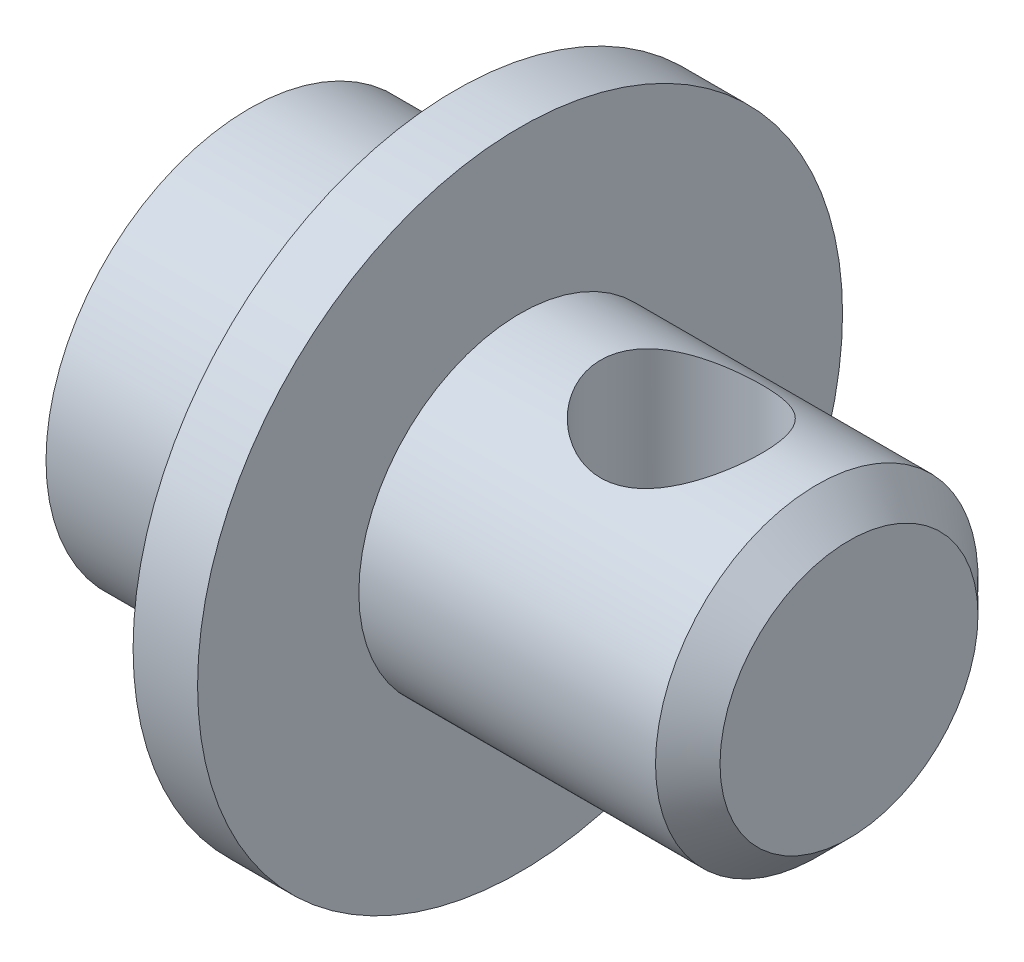
ISO-10303-21;
HEADER;
FILE_DESCRIPTION(('STEP AP214'),'2;1');
FILE_NAME('part.step','',(''),(''),'','','');
FILE_SCHEMA(('AUTOMOTIVE_DESIGN { 1 0 10303 214 1 1 1 1 }'));
ENDSEC;
DATA;
#1=APPLICATION_CONTEXT('core data for automotive mechanical design processes');
#2=APPLICATION_PROTOCOL_DEFINITION('international standard','automotive_design',2000,#1);
#3=PRODUCT_CONTEXT('',#1,'mechanical');
#4=PRODUCT('Part','Part','',(#3));
#5=PRODUCT_RELATED_PRODUCT_CATEGORY('part','',(#4));
#6=PRODUCT_DEFINITION_FORMATION('','',#4);
#7=PRODUCT_DEFINITION_CONTEXT('part definition',#1,'design');
#8=PRODUCT_DEFINITION('design','',#6,#7);
#9=PRODUCT_DEFINITION_SHAPE('','',#8);
#10=(LENGTH_UNIT() NAMED_UNIT(*) SI_UNIT(.MILLI.,.METRE.));
#11=(NAMED_UNIT(*) PLANE_ANGLE_UNIT() SI_UNIT($,.RADIAN.));
#12=(NAMED_UNIT(*) SI_UNIT($,.STERADIAN.) SOLID_ANGLE_UNIT());
#13=UNCERTAINTY_MEASURE_WITH_UNIT(LENGTH_MEASURE(1.E-05),#10,'distance_accuracy_value','');
#14=(GEOMETRIC_REPRESENTATION_CONTEXT(3) GLOBAL_UNCERTAINTY_ASSIGNED_CONTEXT((#13)) GLOBAL_UNIT_ASSIGNED_CONTEXT((#10,
#11,#12)) REPRESENTATION_CONTEXT('',''));
#15=CARTESIAN_POINT('',(0.,0.,0.));
#16=DIRECTION('',(0.,0.,1.));
#17=DIRECTION('',(1.,0.,0.));
#18=AXIS2_PLACEMENT_3D('',#15,#16,#17);
#19=CARTESIAN_POINT('',(5.,0.,0.));
#20=DIRECTION('',(1.,0.,0.));
#21=DIRECTION('',(0.,0.,-1.));
#22=AXIS2_PLACEMENT_3D('',#19,#20,#21);
#23=PLANE('',#22);
#24=CARTESIAN_POINT('',(5.,0.,0.));
#25=DIRECTION('',(-1.,0.,0.));
#26=DIRECTION('',(0.,0.,1.));
#27=AXIS2_PLACEMENT_3D('',#24,#25,#26);
#28=CIRCLE('',#27,1.72719999999999);
#29=CARTESIAN_POINT('',(5.,0.,1.72719999999999));
#30=VERTEX_POINT('',#29);
#31=EDGE_CURVE('E18',#30,#30,#28,.T.);
#32=ORIENTED_EDGE('',*,*,#31,.T.);
#33=EDGE_LOOP('',(#32));
#34=FACE_BOUND('',#33,.T.);
#35=ADVANCED_FACE('F15',(#34),#23,.F.);
#36=CARTESIAN_POINT('',(0.,0.,0.));
#37=DIRECTION('',(-1.,0.,0.));
#38=DIRECTION('',(0.,0.,1.));
#39=AXIS2_PLACEMENT_3D('',#36,#37,#38);
#40=CYLINDRICAL_SURFACE('',#39,1.72719999999999);
#41=ORIENTED_EDGE('',*,*,#31,.F.);
#42=EDGE_LOOP('',(#41));
#43=FACE_BOUND('',#42,.T.);
#44=CARTESIAN_POINT('',(0.,0.,0.));
#45=DIRECTION('',(-1.,0.,0.));
#46=DIRECTION('',(0.,0.,1.));
#47=AXIS2_PLACEMENT_3D('',#44,#45,#46);
#48=CIRCLE('',#47,1.72719999999999);
#49=CARTESIAN_POINT('',(0.,0.,1.72719999999999));
#50=VERTEX_POINT('',#49);
#51=EDGE_CURVE('E160',#50,#50,#48,.T.);
#52=ORIENTED_EDGE('',*,*,#51,.T.);
#53=EDGE_LOOP('',(#52));
#54=FACE_BOUND('',#53,.T.);
#55=ADVANCED_FACE('F135',(#43,#54),#40,.F.);
#56=CARTESIAN_POINT('',(0.,0.,0.));
#57=DIRECTION('',(1.,0.,0.));
#58=DIRECTION('',(0.,0.,-1.));
#59=AXIS2_PLACEMENT_3D('',#56,#57,#58);
#60=PLANE('',#59);
#61=CARTESIAN_POINT('',(0.,0.,0.));
#62=DIRECTION('',(-1.,0.,0.));
#63=DIRECTION('',(0.,0.,1.));
#64=AXIS2_PLACEMENT_3D('',#61,#62,#63);
#65=CIRCLE('',#64,3.15);
#66=CARTESIAN_POINT('',(0.,0.,3.15));
#67=VERTEX_POINT('',#66);
#68=EDGE_CURVE('E162',#67,#67,#65,.F.);
#69=ORIENTED_EDGE('',*,*,#68,.F.);
#70=EDGE_LOOP('',(#69));
#71=FACE_BOUND('',#70,.T.);
#72=ORIENTED_EDGE('',*,*,#51,.F.);
#73=EDGE_LOOP('',(#72));
#74=FACE_BOUND('',#73,.T.);
#75=ADVANCED_FACE('F125',(#71,#74),#60,.F.);
#76=CARTESIAN_POINT('',(0.,0.,0.));
#77=DIRECTION('',(-1.,0.,0.));
#78=DIRECTION('',(0.,0.,1.));
#79=AXIS2_PLACEMENT_3D('',#76,#77,#78);
#80=CYLINDRICAL_SURFACE('',#79,3.15);
#81=ORIENTED_EDGE('',*,*,#68,.T.);
#82=EDGE_LOOP('',(#81));
#83=FACE_BOUND('',#82,.T.);
#84=CARTESIAN_POINT('',(3.2,0.,0.));
#85=DIRECTION('',(-1.,0.,0.));
#86=DIRECTION('',(0.,0.,1.));
#87=AXIS2_PLACEMENT_3D('',#84,#85,#86);
#88=CIRCLE('',#87,3.15);
#89=CARTESIAN_POINT('',(3.2,0.,3.15));
#90=VERTEX_POINT('',#89);
#91=EDGE_CURVE('E166',#90,#90,#88,.T.);
#92=ORIENTED_EDGE('',*,*,#91,.T.);
#93=EDGE_LOOP('',(#92));
#94=FACE_BOUND('',#93,.T.);
#95=ADVANCED_FACE('F115',(#83,#94),#80,.T.);
#96=CARTESIAN_POINT('',(9.3,2.5,0.));
#97=DIRECTION('',(-1.,0.,0.));
#98=DIRECTION('',(0.,0.,1.));
#99=AXIS2_PLACEMENT_3D('',#96,#97,#98);
#100=PLANE('',#99);
#101=CARTESIAN_POINT('',(9.29999999993925,0.,0.));
#102=DIRECTION('',(-1.,0.,0.));
#103=DIRECTION('',(0.,0.,1.));
#104=AXIS2_PLACEMENT_3D('',#101,#102,#103);
#105=CIRCLE('',#104,2.00000000000955);
#106=CARTESIAN_POINT('',(9.29999999993925,0.,2.00000000000955));
#107=VERTEX_POINT('',#106);
#108=EDGE_CURVE('E171',#107,#107,#105,.T.);
#109=ORIENTED_EDGE('',*,*,#108,.F.);
#110=EDGE_LOOP('',(#109));
#111=FACE_BOUND('',#110,.T.);
#112=ADVANCED_FACE('F106',(#111),#100,.F.);
#113=CARTESIAN_POINT('',(3.2,3.15,0.));
#114=DIRECTION('',(1.,0.,0.));
#115=DIRECTION('',(0.,0.,-1.));
#116=AXIS2_PLACEMENT_3D('',#113,#114,#115);
#117=PLANE('',#116);
#118=CARTESIAN_POINT('',(3.2,0.,0.));
#119=DIRECTION('',(-1.,0.,0.));
#120=DIRECTION('',(0.,0.,1.));
#121=AXIS2_PLACEMENT_3D('',#118,#119,#120);
#122=CIRCLE('',#121,5.);
#123=CARTESIAN_POINT('',(3.2,0.,5.));
#124=VERTEX_POINT('',#123);
#125=EDGE_CURVE('E173',#124,#124,#122,.F.);
#126=ORIENTED_EDGE('',*,*,#125,.F.);
#127=EDGE_LOOP('',(#126));
#128=FACE_BOUND('',#127,.T.);
#129=ORIENTED_EDGE('',*,*,#91,.F.);
#130=EDGE_LOOP('',(#129));
#131=FACE_BOUND('',#130,.T.);
#132=ADVANCED_FACE('F63',(#128,#131),#117,.F.);
#133=CARTESIAN_POINT('',(6.7,3.15,0.));
#134=DIRECTION('',(0.,1.,0.));
#135=DIRECTION('',(0.,0.,1.));
#136=AXIS2_PLACEMENT_3D('',#133,#134,#135);
#137=CYLINDRICAL_SURFACE('',#136,1.24999999999999);
#138=CARTESIAN_POINT('',(6.7,-2.1650635094611,-1.24999999999999));
#139=CARTESIAN_POINT('',(6.63481172002559,-2.16506838982179,-1.24999617124581));
#140=CARTESIAN_POINT('',(6.56958502661292,-2.16804993552037,-1.24487067896227));
#141=CARTESIAN_POINT('',(6.44116808636668,-2.17953710676785,-1.22464078873759));
#142=CARTESIAN_POINT('',(6.37798046630098,-2.18804958080745,-1.2095240190243));
#143=CARTESIAN_POINT('',(6.25568936290287,-2.20936578691023,-1.17012682667043));
#144=CARTESIAN_POINT('',(6.19656726524359,-2.22214813683207,-1.14589198942546));
#145=CARTESIAN_POINT('',(6.0832303615766,-2.2505304074314,-1.08909048153733));
#146=CARTESIAN_POINT('',(6.02901673960611,-2.26613100523112,-1.05652180779222));
#147=CARTESIAN_POINT('',(5.92211670932823,-2.29996117086729,-0.980832482292492));
#148=CARTESIAN_POINT('',(5.86992419975127,-2.31830144129147,-0.937063501426168));
#149=CARTESIAN_POINT('',(5.77323798701866,-2.35465042041645,-0.841565436820132));
#150=CARTESIAN_POINT('',(5.72874785164902,-2.37265897203023,-0.789832685062376));
#151=CARTESIAN_POINT('',(5.64579111628311,-2.40776843326295,-0.675612046385247));
#152=CARTESIAN_POINT('',(5.60793290372757,-2.42472627794535,-0.61263418065022));
#153=CARTESIAN_POINT('',(5.54357401794855,-2.45438441226071,-0.480196496338259));
#154=CARTESIAN_POINT('',(5.51706621168051,-2.46708737473373,-0.410740782222568));
#155=CARTESIAN_POINT('',(5.47811920440502,-2.48600575009973,-0.272556293222266));
#156=CARTESIAN_POINT('',(5.46481313684234,-2.49261848035696,-0.20412747174254));
#157=CARTESIAN_POINT('',(5.44979235819755,-2.50009479492718,-0.0657135248962532));
#158=CARTESIAN_POINT('',(5.44807067291922,-2.50096183833635,0.00427063863183585));
#159=CARTESIAN_POINT('',(5.45593334878169,-2.49703727035326,0.137290776771626));
#160=CARTESIAN_POINT('',(5.46454754961346,-2.49273118195073,0.200401739903215));
#161=CARTESIAN_POINT('',(5.49110112612063,-2.47967803257136,0.324142446725601));
#162=CARTESIAN_POINT('',(5.5090411640942,-2.47093065618612,0.384772013863789));
#163=CARTESIAN_POINT('',(5.55385337590356,-2.44964470560957,0.502887210280419));
#164=CARTESIAN_POINT('',(5.5808457797671,-2.43705531757577,0.560317688061293));
#165=CARTESIAN_POINT('',(5.64282986823493,-2.409220333515,0.669971837823869));
#166=CARTESIAN_POINT('',(5.67782429006122,-2.39397382900303,0.722193719320395));
#167=CARTESIAN_POINT('',(5.7586152708293,-2.36055647673726,0.825212275877134));
#168=CARTESIAN_POINT('',(5.80511986671019,-2.34224543631376,0.875408604554599));
#169=CARTESIAN_POINT('',(5.90572815924288,-2.30568253353098,0.967623032738795));
#170=CARTESIAN_POINT('',(5.9598389839203,-2.28743074330243,1.0096333717631));
#171=CARTESIAN_POINT('',(6.07834343780867,-2.25179109673456,1.08690476288465));
#172=CARTESIAN_POINT('',(6.14317363413855,-2.23453339221212,1.12156140464931));
#173=CARTESIAN_POINT('',(6.27876523901212,-2.20467863249232,1.17917685422958));
#174=CARTESIAN_POINT('',(6.34951319215631,-2.19207133885325,1.20216140214402));
#175=CARTESIAN_POINT('',(6.46743107809815,-2.17705185945649,1.22905642020608));
#176=CARTESIAN_POINT('',(6.51347598229663,-2.17258896623516,1.23688856915693));
#177=CARTESIAN_POINT('',(6.60634073769963,-2.16659329254661,1.24736128340391));
#178=CARTESIAN_POINT('',(6.65316045278132,-2.16506000278958,1.25000275106372));
#179=CARTESIAN_POINT('',(6.76518827997441,-2.16506838982179,1.24999617124581));
#180=CARTESIAN_POINT('',(6.83041497338708,-2.16804993552037,1.24487067896227));
#181=CARTESIAN_POINT('',(6.95883191363332,-2.17953710676785,1.22464078873759));
#182=CARTESIAN_POINT('',(7.02201953369902,-2.18804958080745,1.2095240190243));
#183=CARTESIAN_POINT('',(7.14431063709713,-2.20936578691023,1.17012682667043));
#184=CARTESIAN_POINT('',(7.20343273475641,-2.22214813683207,1.14589198942546));
#185=CARTESIAN_POINT('',(7.3167696384234,-2.2505304074314,1.08909048153733));
#186=CARTESIAN_POINT('',(7.37098326039389,-2.26613100523112,1.05652180779222));
#187=CARTESIAN_POINT('',(7.47788329067177,-2.29996117086729,0.980832482292493));
#188=CARTESIAN_POINT('',(7.53007580024873,-2.31830144129147,0.937063501426168));
#189=CARTESIAN_POINT('',(7.62676201298134,-2.35465042041644,0.841565436820132));
#190=CARTESIAN_POINT('',(7.67125214835098,-2.37265897203023,0.789832685062377));
#191=CARTESIAN_POINT('',(7.75420888371689,-2.40776843326295,0.675612046385248));
#192=CARTESIAN_POINT('',(7.79206709627243,-2.42472627794535,0.612634180650221));
#193=CARTESIAN_POINT('',(7.85642598205145,-2.45438441226071,0.48019649633826));
#194=CARTESIAN_POINT('',(7.88293378831949,-2.46708737473373,0.410740782222569));
#195=CARTESIAN_POINT('',(7.92188079559498,-2.48600575009973,0.272556293222267));
#196=CARTESIAN_POINT('',(7.93518686315766,-2.49261848035696,0.204127471742541));
#197=CARTESIAN_POINT('',(7.95020764180245,-2.50009479492718,0.0657135248962542));
#198=CARTESIAN_POINT('',(7.95192932708078,-2.50096183833635,-0.00427063863183497));
#199=CARTESIAN_POINT('',(7.94406665121831,-2.49703727035326,-0.137290776771625));
#200=CARTESIAN_POINT('',(7.93545245038654,-2.49273118195073,-0.200401739903213));
#201=CARTESIAN_POINT('',(7.90889887387937,-2.47967803257136,-0.324142446725599));
#202=CARTESIAN_POINT('',(7.8909588359058,-2.47093065618612,-0.384772013863788));
#203=CARTESIAN_POINT('',(7.84614662409644,-2.44964470560957,-0.502887210280418));
#204=CARTESIAN_POINT('',(7.8191542202329,-2.43705531757577,-0.560317688061292));
#205=CARTESIAN_POINT('',(7.75717013176508,-2.409220333515,-0.669971837823868));
#206=CARTESIAN_POINT('',(7.72217570993878,-2.39397382900303,-0.722193719320394));
#207=CARTESIAN_POINT('',(7.6413847291707,-2.36055647673726,-0.825212275877133));
#208=CARTESIAN_POINT('',(7.59488013328981,-2.34224543631377,-0.875408604554598));
#209=CARTESIAN_POINT('',(7.49427184075712,-2.30568253353098,-0.967623032738794));
#210=CARTESIAN_POINT('',(7.4401610160797,-2.28743074330243,-1.0096333717631));
#211=CARTESIAN_POINT('',(7.32165656219133,-2.25179109673456,-1.08690476288465));
#212=CARTESIAN_POINT('',(7.25682636586145,-2.23453339221212,-1.12156140464931));
#213=CARTESIAN_POINT('',(7.12123476098789,-2.20467863249232,-1.17917685422958));
#214=CARTESIAN_POINT('',(7.0504868078437,-2.19207133885325,-1.20216140214402));
#215=CARTESIAN_POINT('',(6.93256892190185,-2.17705185945649,-1.22905642020608));
#216=CARTESIAN_POINT('',(6.88652401770337,-2.17258896623516,-1.23688856915693));
#217=CARTESIAN_POINT('',(6.79365926230037,-2.16659329254661,-1.24736128340391));
#218=CARTESIAN_POINT('',(6.74683954721868,-2.16506000278958,-1.25000275106372));
#219=CARTESIAN_POINT('',(6.7,-2.1650635094611,-1.24999999999999));
#220=B_SPLINE_CURVE_WITH_KNOTS('',3,(#138,#139,#140,#141,#142,#143,#144,#145,#146,#147,#148,
#149,#150,#151,#152,#153,#154,#155,#156,#157,#158,#159,#160,#161,#162,#163,#164,#165,#166,#167,
#168,#169,#170,#171,#172,#173,#174,#175,#176,#177,#178,#179,#180,#181,#182,#183,#184,#185,#186,
#187,#188,#189,#190,#191,#192,#193,#194,#195,#196,#197,#198,#199,#200,#201,#202,#203,#204,#205,
#206,#207,#208,#209,#210,#211,#212,#213,#214,#215,#216,#217,#218,#219),.UNSPECIFIED.,.T.,.F.,(4,
2,2,2,2,2,2,2,2,2,2,2,2,2,2,2,2,2,2,2,2,2,2,2,2,2,2,2,2,2,2,2,2,2,2,2,2,2,2,2,4),(0.,
0.195374359917666,0.39099109794099,0.585642580553922,0.780340893172691,0.991081580767888,
1.20191962504567,1.42697329471268,1.65188532342745,1.86079319340992,2.06957528241361,
2.26020156774943,2.45084139274821,2.64412070353892,2.83746622786548,3.04907108835458,
3.26087558879132,3.4862422419504,3.71110971910199,3.85151590650287,3.99189768310864,
4.18727204302631,4.38288878104963,4.57754026366256,4.77223857628133,4.98297926387653,
5.19381730815431,5.41887097782131,5.64378300653609,5.85269087651856,6.06147296552225,
6.25209925085807,6.44273907585685,6.63601838664756,6.82936391097411,7.04096877146322,
7.25277327189995,7.47813992505904,7.70300740221063,7.84341358961151,7.98379536621728),.UNSPECIFIED.);
#221=CARTESIAN_POINT('',(6.7,-2.1650635094611,-1.24999999999999));
#222=VERTEX_POINT('',#221);
#223=EDGE_CURVE('E38',#222,#222,#220,.T.);
#224=ORIENTED_EDGE('',*,*,#223,.F.);
#225=EDGE_LOOP('',(#224));
#226=FACE_BOUND('',#225,.T.);
#227=CARTESIAN_POINT('',(6.7,2.1650635094611,-1.24999999999999));
#228=CARTESIAN_POINT('',(6.76518827997441,2.16506838982179,-1.24999617124581));
#229=CARTESIAN_POINT('',(6.83041497338708,2.16804993552037,-1.24487067896227));
#230=CARTESIAN_POINT('',(6.95883191363332,2.17953710676785,-1.22464078873759));
#231=CARTESIAN_POINT('',(7.02201953369902,2.18804958080745,-1.2095240190243));
#232=CARTESIAN_POINT('',(7.14431063709713,2.20936578691023,-1.17012682667043));
#233=CARTESIAN_POINT('',(7.20343273475641,2.22214813683207,-1.14589198942546));
#234=CARTESIAN_POINT('',(7.3167696384234,2.2505304074314,-1.08909048153733));
#235=CARTESIAN_POINT('',(7.37098326039389,2.26613100523112,-1.05652180779222));
#236=CARTESIAN_POINT('',(7.47788329067177,2.29996117086729,-0.980832482292491));
#237=CARTESIAN_POINT('',(7.53007580024873,2.31830144129147,-0.937063501426167));
#238=CARTESIAN_POINT('',(7.62676201298134,2.35465042041645,-0.841565436820131));
#239=CARTESIAN_POINT('',(7.67125214835098,2.37265897203023,-0.789832685062375));
#240=CARTESIAN_POINT('',(7.75420888371689,2.40776843326295,-0.675612046385246));
#241=CARTESIAN_POINT('',(7.79206709627244,2.42472627794535,-0.612634180650219));
#242=CARTESIAN_POINT('',(7.85642598205145,2.45438441226071,-0.480196496338259));
#243=CARTESIAN_POINT('',(7.88293378831949,2.46708737473373,-0.410740782222568));
#244=CARTESIAN_POINT('',(7.92188079559498,2.48600575009973,-0.272556293222266));
#245=CARTESIAN_POINT('',(7.93518686315766,2.49261848035696,-0.204127471742541));
#246=CARTESIAN_POINT('',(7.95020764180245,2.50009479492718,-0.0657135248962537));
#247=CARTESIAN_POINT('',(7.95192932708078,2.50096183833635,0.00427063863183544));
#248=CARTESIAN_POINT('',(7.94406665121831,2.49703727035326,0.137290776771625));
#249=CARTESIAN_POINT('',(7.93545245038654,2.49273118195073,0.200401739903214));
#250=CARTESIAN_POINT('',(7.90889887387937,2.47967803257136,0.3241424467256));
#251=CARTESIAN_POINT('',(7.8909588359058,2.47093065618612,0.384772013863789));
#252=CARTESIAN_POINT('',(7.84614662409644,2.44964470560957,0.502887210280419));
#253=CARTESIAN_POINT('',(7.8191542202329,2.43705531757577,0.560317688061293));
#254=CARTESIAN_POINT('',(7.75717013176508,2.409220333515,0.66997183782387));
#255=CARTESIAN_POINT('',(7.72217570993878,2.39397382900303,0.722193719320395));
#256=CARTESIAN_POINT('',(7.6413847291707,2.36055647673725,0.825212275877134));
#257=CARTESIAN_POINT('',(7.59488013328981,2.34224543631376,0.8754086045546));
#258=CARTESIAN_POINT('',(7.49427184075712,2.30568253353097,0.967623032738796));
#259=CARTESIAN_POINT('',(7.4401610160797,2.28743074330243,1.0096333717631));
#260=CARTESIAN_POINT('',(7.32165656219133,2.25179109673456,1.08690476288465));
#261=CARTESIAN_POINT('',(7.25682636586145,2.23453339221212,1.12156140464931));
#262=CARTESIAN_POINT('',(7.12123476098788,2.20467863249232,1.17917685422958));
#263=CARTESIAN_POINT('',(7.05048680784369,2.19207133885325,1.20216140214402));
#264=CARTESIAN_POINT('',(6.93256892190185,2.17705185945649,1.22905642020608));
#265=CARTESIAN_POINT('',(6.88652401770337,2.17258896623516,1.23688856915693));
#266=CARTESIAN_POINT('',(6.79365926230037,2.16659329254661,1.24736128340391));
#267=CARTESIAN_POINT('',(6.74683954721868,2.16506000278958,1.25000275106372));
#268=CARTESIAN_POINT('',(6.63481172002559,2.16506838982179,1.24999617124581));
#269=CARTESIAN_POINT('',(6.56958502661292,2.16804993552037,1.24487067896227));
#270=CARTESIAN_POINT('',(6.44116808636668,2.17953710676785,1.22464078873759));
#271=CARTESIAN_POINT('',(6.37798046630098,2.18804958080745,1.2095240190243));
#272=CARTESIAN_POINT('',(6.25568936290287,2.20936578691023,1.17012682667043));
#273=CARTESIAN_POINT('',(6.19656726524359,2.22214813683207,1.14589198942546));
#274=CARTESIAN_POINT('',(6.0832303615766,2.2505304074314,1.08909048153733));
#275=CARTESIAN_POINT('',(6.02901673960611,2.26613100523112,1.05652180779222));
#276=CARTESIAN_POINT('',(5.92211670932823,2.29996117086729,0.980832482292491));
#277=CARTESIAN_POINT('',(5.86992419975127,2.31830144129147,0.937063501426167));
#278=CARTESIAN_POINT('',(5.77323798701866,2.35465042041645,0.841565436820131));
#279=CARTESIAN_POINT('',(5.72874785164902,2.37265897203023,0.789832685062375));
#280=CARTESIAN_POINT('',(5.64579111628311,2.40776843326295,0.675612046385247));
#281=CARTESIAN_POINT('',(5.60793290372757,2.42472627794535,0.61263418065022));
#282=CARTESIAN_POINT('',(5.54357401794855,2.45438441226071,0.480196496338259));
#283=CARTESIAN_POINT('',(5.51706621168051,2.46708737473373,0.410740782222568));
#284=CARTESIAN_POINT('',(5.47811920440502,2.48600575009973,0.272556293222266));
#285=CARTESIAN_POINT('',(5.46481313684234,2.49261848035696,0.20412747174254));
#286=CARTESIAN_POINT('',(5.44979235819755,2.50009479492718,0.0657135248962532));
#287=CARTESIAN_POINT('',(5.44807067291922,2.50096183833635,-0.0042706386318359));
#288=CARTESIAN_POINT('',(5.45593334878169,2.49703727035326,-0.137290776771626));
#289=CARTESIAN_POINT('',(5.46454754961346,2.49273118195073,-0.200401739903215));
#290=CARTESIAN_POINT('',(5.49110112612063,2.47967803257136,-0.324142446725601));
#291=CARTESIAN_POINT('',(5.5090411640942,2.47093065618612,-0.38477201386379));
#292=CARTESIAN_POINT('',(5.55385337590356,2.44964470560957,-0.502887210280419));
#293=CARTESIAN_POINT('',(5.5808457797671,2.43705531757577,-0.560317688061293));
#294=CARTESIAN_POINT('',(5.64282986823493,2.409220333515,-0.669971837823869));
#295=CARTESIAN_POINT('',(5.67782429006122,2.39397382900303,-0.722193719320395));
#296=CARTESIAN_POINT('',(5.7586152708293,2.36055647673725,-0.825212275877134));
#297=CARTESIAN_POINT('',(5.80511986671019,2.34224543631376,-0.8754086045546));
#298=CARTESIAN_POINT('',(5.90572815924288,2.30568253353097,-0.967623032738796));
#299=CARTESIAN_POINT('',(5.9598389839203,2.28743074330243,-1.0096333717631));
#300=CARTESIAN_POINT('',(6.07834343780867,2.25179109673456,-1.08690476288465));
#301=CARTESIAN_POINT('',(6.14317363413855,2.23453339221212,-1.12156140464931));
#302=CARTESIAN_POINT('',(6.27876523901211,2.20467863249232,-1.17917685422958));
#303=CARTESIAN_POINT('',(6.34951319215631,2.19207133885325,-1.20216140214402));
#304=CARTESIAN_POINT('',(6.46743107809815,2.17705185945649,-1.22905642020608));
#305=CARTESIAN_POINT('',(6.51347598229663,2.17258896623516,-1.23688856915693));
#306=CARTESIAN_POINT('',(6.60634073769963,2.16659329254661,-1.24736128340391));
#307=CARTESIAN_POINT('',(6.65316045278132,2.16506000278958,-1.25000275106372));
#308=CARTESIAN_POINT('',(6.7,2.1650635094611,-1.24999999999999));
#309=B_SPLINE_CURVE_WITH_KNOTS('',3,(#227,#228,#229,#230,#231,#232,#233,#234,#235,#236,#237,
#238,#239,#240,#241,#242,#243,#244,#245,#246,#247,#248,#249,#250,#251,#252,#253,#254,#255,#256,
#257,#258,#259,#260,#261,#262,#263,#264,#265,#266,#267,#268,#269,#270,#271,#272,#273,#274,#275,
#276,#277,#278,#279,#280,#281,#282,#283,#284,#285,#286,#287,#288,#289,#290,#291,#292,#293,#294,
#295,#296,#297,#298,#299,#300,#301,#302,#303,#304,#305,#306,#307,#308),.UNSPECIFIED.,.T.,.F.,(4,
2,2,2,2,2,2,2,2,2,2,2,2,2,2,2,2,2,2,2,2,2,2,2,2,2,2,2,2,2,2,2,2,2,2,2,2,2,2,2,4),(0.,
0.195374359917666,0.39099109794099,0.585642580553923,0.780340893172691,0.991081580767888,
1.20191962504567,1.42697329471268,1.65188532342745,1.86079319340992,2.06957528241361,
2.26020156774943,2.45084139274821,2.64412070353892,2.83746622786548,3.04907108835458,
3.26087558879131,3.4862422419504,3.71110971910199,3.85151590650287,3.99189768310864,
4.1872720430263,4.38288878104963,4.57754026366256,4.77223857628133,4.98297926387653,
5.19381730815431,5.41887097782131,5.64378300653608,5.85269087651856,6.06147296552225,
6.25209925085807,6.44273907585685,6.63601838664756,6.82936391097411,7.04096877146322,
7.25277327189995,7.47813992505904,7.70300740221063,7.84341358961151,7.98379536621728),.UNSPECIFIED.);
#310=CARTESIAN_POINT('',(6.7,2.1650635094611,-1.24999999999999));
#311=VERTEX_POINT('',#310);
#312=EDGE_CURVE('E31',#311,#311,#309,.T.);
#313=ORIENTED_EDGE('',*,*,#312,.F.);
#314=EDGE_LOOP('',(#313));
#315=FACE_BOUND('',#314,.T.);
#316=ADVANCED_FACE('F42',(#226,#315),#137,.F.);
#317=CARTESIAN_POINT('',(8.80000000006476,0.,0.));
#318=DIRECTION('',(-1.,0.,0.));
#319=DIRECTION('',(0.,0.,1.));
#320=AXIS2_PLACEMENT_3D('',#317,#318,#319);
#321=CONICAL_SURFACE('',#320,2.49999999994088,0.785398163454292);
#322=CARTESIAN_POINT('',(8.8,0.,0.));
#323=DIRECTION('',(-1.,0.,0.));
#324=DIRECTION('',(0.,0.,1.));
#325=AXIS2_PLACEMENT_3D('',#322,#323,#324);
#326=CIRCLE('',#325,2.5);
#327=CARTESIAN_POINT('',(8.8,0.,2.5));
#328=VERTEX_POINT('',#327);
#329=EDGE_CURVE('E27',#328,#328,#326,.T.);
#330=ORIENTED_EDGE('',*,*,#329,.F.);
#331=EDGE_LOOP('',(#330));
#332=FACE_BOUND('',#331,.T.);
#333=ORIENTED_EDGE('',*,*,#108,.T.);
#334=EDGE_LOOP('',(#333));
#335=FACE_BOUND('',#334,.T.);
#336=ADVANCED_FACE('F55',(#332,#335),#321,.T.);
#337=CARTESIAN_POINT('',(0.,0.,0.));
#338=DIRECTION('',(-1.,0.,0.));
#339=DIRECTION('',(0.,0.,1.));
#340=AXIS2_PLACEMENT_3D('',#337,#338,#339);
#341=CYLINDRICAL_SURFACE('',#340,5.);
#342=ORIENTED_EDGE('',*,*,#125,.T.);
#343=EDGE_LOOP('',(#342));
#344=FACE_BOUND('',#343,.T.);
#345=CARTESIAN_POINT('',(4.2,0.,0.));
#346=DIRECTION('',(-1.,0.,0.));
#347=DIRECTION('',(0.,0.,1.));
#348=AXIS2_PLACEMENT_3D('',#345,#346,#347);
#349=CIRCLE('',#348,5.);
#350=CARTESIAN_POINT('',(4.2,0.,5.));
#351=VERTEX_POINT('',#350);
#352=EDGE_CURVE('E22',#351,#351,#349,.T.);
#353=ORIENTED_EDGE('',*,*,#352,.T.);
#354=EDGE_LOOP('',(#353));
#355=FACE_BOUND('',#354,.T.);
#356=ADVANCED_FACE('F52',(#344,#355),#341,.T.);
#357=CARTESIAN_POINT('',(0.,0.,0.));
#358=DIRECTION('',(-1.,0.,0.));
#359=DIRECTION('',(0.,0.,1.));
#360=AXIS2_PLACEMENT_3D('',#357,#358,#359);
#361=CYLINDRICAL_SURFACE('',#360,2.5);
#362=CARTESIAN_POINT('',(4.2,0.,0.));
#363=DIRECTION('',(-1.,0.,0.));
#364=DIRECTION('',(0.,0.,1.));
#365=AXIS2_PLACEMENT_3D('',#362,#363,#364);
#366=CIRCLE('',#365,2.5);
#367=CARTESIAN_POINT('',(4.2,0.,2.5));
#368=VERTEX_POINT('',#367);
#369=EDGE_CURVE('E10',#368,#368,#366,.F.);
#370=ORIENTED_EDGE('',*,*,#369,.T.);
#371=EDGE_LOOP('',(#370));
#372=FACE_BOUND('',#371,.T.);
#373=ORIENTED_EDGE('',*,*,#329,.T.);
#374=EDGE_LOOP('',(#373));
#375=FACE_BOUND('',#374,.T.);
#376=ORIENTED_EDGE('',*,*,#312,.T.);
#377=EDGE_LOOP('',(#376));
#378=FACE_BOUND('',#377,.T.);
#379=ORIENTED_EDGE('',*,*,#223,.T.);
#380=EDGE_LOOP('',(#379));
#381=FACE_BOUND('',#380,.T.);
#382=ADVANCED_FACE('F46',(#372,#375,#378,#381),#361,.T.);
#383=CARTESIAN_POINT('',(4.2,5.,0.));
#384=DIRECTION('',(-1.,0.,0.));
#385=DIRECTION('',(0.,0.,1.));
#386=AXIS2_PLACEMENT_3D('',#383,#384,#385);
#387=PLANE('',#386);
#388=ORIENTED_EDGE('',*,*,#369,.F.);
#389=EDGE_LOOP('',(#388));
#390=FACE_BOUND('',#389,.T.);
#391=ORIENTED_EDGE('',*,*,#352,.F.);
#392=EDGE_LOOP('',(#391));
#393=FACE_BOUND('',#392,.T.);
#394=ADVANCED_FACE('F51',(#390,#393),#387,.F.);
#395=CLOSED_SHELL('',(#35,#55,#75,#95,#112,#132,#316,#336,#356,#382,#394));
#396=MANIFOLD_SOLID_BREP('B1',#395);
#397=ADVANCED_BREP_SHAPE_REPRESENTATION('',(#18,#396),#14);
#398=SHAPE_DEFINITION_REPRESENTATION(#9,#397);
ENDSEC;
END-ISO-10303-21;
